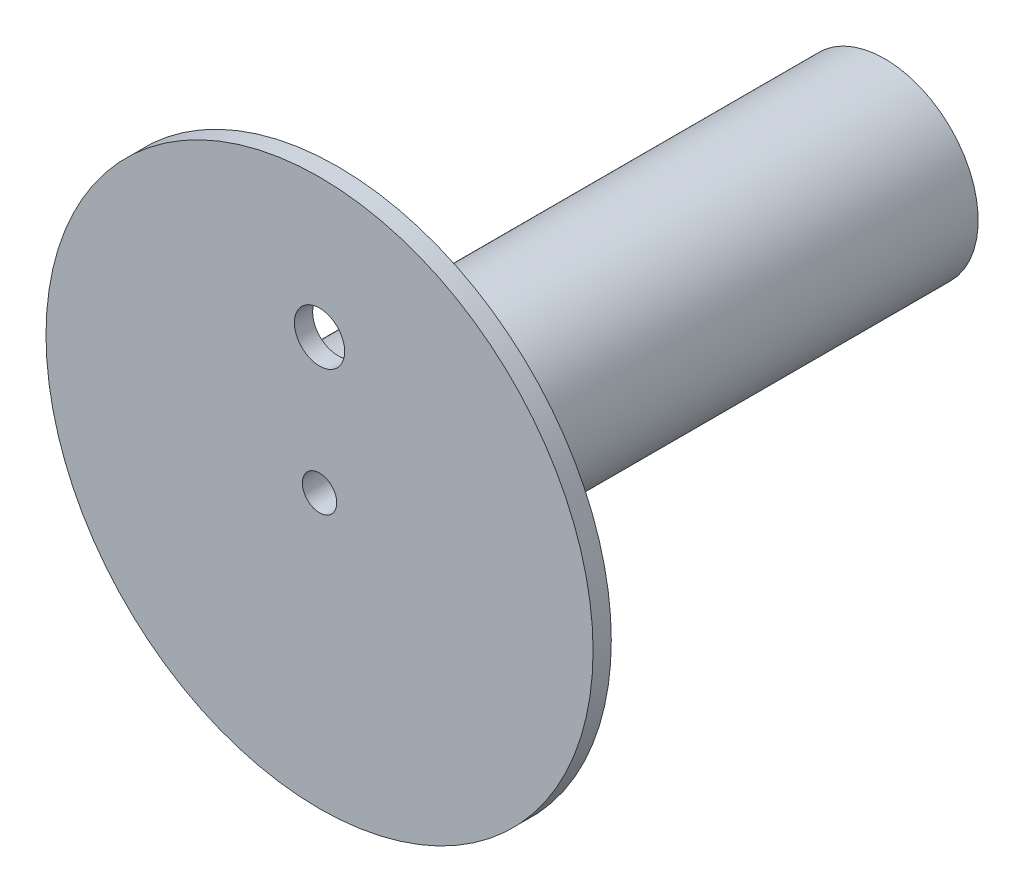
ISO-10303-21;
HEADER;
FILE_DESCRIPTION(('STEP AP214'),'2;1');
FILE_NAME('part.step','',(''),(''),'','','');
FILE_SCHEMA(('AUTOMOTIVE_DESIGN { 1 0 10303 214 1 1 1 1 }'));
ENDSEC;
DATA;
#1=APPLICATION_CONTEXT('core data for automotive mechanical design processes');
#2=APPLICATION_PROTOCOL_DEFINITION('international standard','automotive_design',2000,#1);
#3=PRODUCT_CONTEXT('',#1,'mechanical');
#4=PRODUCT('Part','Part','',(#3));
#5=PRODUCT_RELATED_PRODUCT_CATEGORY('part','',(#4));
#6=PRODUCT_DEFINITION_FORMATION('','',#4);
#7=PRODUCT_DEFINITION_CONTEXT('part definition',#1,'design');
#8=PRODUCT_DEFINITION('design','',#6,#7);
#9=PRODUCT_DEFINITION_SHAPE('','',#8);
#10=(LENGTH_UNIT() NAMED_UNIT(*) SI_UNIT(.MILLI.,.METRE.));
#11=(NAMED_UNIT(*) PLANE_ANGLE_UNIT() SI_UNIT($,.RADIAN.));
#12=(NAMED_UNIT(*) SI_UNIT($,.STERADIAN.) SOLID_ANGLE_UNIT());
#13=UNCERTAINTY_MEASURE_WITH_UNIT(LENGTH_MEASURE(1.E-05),#10,'distance_accuracy_value','');
#14=(GEOMETRIC_REPRESENTATION_CONTEXT(3) GLOBAL_UNCERTAINTY_ASSIGNED_CONTEXT((#13)) GLOBAL_UNIT_ASSIGNED_CONTEXT((#10,
#11,#12)) REPRESENTATION_CONTEXT('',''));
#15=CARTESIAN_POINT('',(0.,0.,0.));
#16=DIRECTION('',(0.,0.,1.));
#17=DIRECTION('',(1.,0.,0.));
#18=AXIS2_PLACEMENT_3D('',#15,#16,#17);
#19=CARTESIAN_POINT('',(0.,0.,38.1));
#20=DIRECTION('',(0.,0.,-1.));
#21=DIRECTION('',(-1.,0.,0.));
#22=AXIS2_PLACEMENT_3D('',#19,#20,#21);
#23=CYLINDRICAL_SURFACE('',#22,6.5);
#24=CARTESIAN_POINT('',(0.,0.,38.1));
#25=DIRECTION('',(0.,0.,1.));
#26=DIRECTION('',(1.,0.,0.));
#27=AXIS2_PLACEMENT_3D('',#24,#25,#26);
#28=CIRCLE('',#27,6.5);
#29=CARTESIAN_POINT('',(-6.5,0.,38.1));
#30=VERTEX_POINT('',#29);
#31=EDGE_CURVE('E10',#30,#30,#28,.T.);
#32=CARTESIAN_POINT('',(0.,0.,0.));
#33=DIRECTION('',(0.,0.,1.));
#34=DIRECTION('',(1.,0.,0.));
#35=AXIS2_PLACEMENT_3D('',#32,#33,#34);
#36=CIRCLE('',#35,6.5);
#37=CARTESIAN_POINT('',(-6.5,0.,0.));
#38=VERTEX_POINT('',#37);
#39=EDGE_CURVE('E40',#38,#38,#36,.T.);
#40=CARTESIAN_POINT('',(-6.5,0.,38.1));
#41=CARTESIAN_POINT('',(-6.5,0.,37.703125));
#42=CARTESIAN_POINT('',(-6.5,0.,37.30625));
#43=CARTESIAN_POINT('',(-6.5,0.,36.5125));
#44=CARTESIAN_POINT('',(-6.5,0.,36.115625));
#45=CARTESIAN_POINT('',(-6.5,0.,35.321875));
#46=CARTESIAN_POINT('',(-6.5,0.,34.925));
#47=CARTESIAN_POINT('',(-6.5,0.,34.13125));
#48=CARTESIAN_POINT('',(-6.5,0.,33.734375));
#49=CARTESIAN_POINT('',(-6.5,0.,32.940625));
#50=CARTESIAN_POINT('',(-6.5,0.,32.54375));
#51=CARTESIAN_POINT('',(-6.5,0.,31.75));
#52=CARTESIAN_POINT('',(-6.5,0.,31.353125));
#53=CARTESIAN_POINT('',(-6.5,0.,30.559375));
#54=CARTESIAN_POINT('',(-6.5,0.,30.1625));
#55=CARTESIAN_POINT('',(-6.5,0.,29.36875));
#56=CARTESIAN_POINT('',(-6.5,0.,28.971875));
#57=CARTESIAN_POINT('',(-6.5,0.,28.178125));
#58=CARTESIAN_POINT('',(-6.5,0.,27.78125));
#59=CARTESIAN_POINT('',(-6.5,0.,26.9875));
#60=CARTESIAN_POINT('',(-6.5,0.,26.590625));
#61=CARTESIAN_POINT('',(-6.5,0.,25.796875));
#62=CARTESIAN_POINT('',(-6.5,0.,25.4));
#63=CARTESIAN_POINT('',(-6.5,0.,24.60625));
#64=CARTESIAN_POINT('',(-6.5,0.,24.209375));
#65=CARTESIAN_POINT('',(-6.5,0.,23.415625));
#66=CARTESIAN_POINT('',(-6.5,0.,23.01875));
#67=CARTESIAN_POINT('',(-6.5,0.,22.225));
#68=CARTESIAN_POINT('',(-6.5,0.,21.828125));
#69=CARTESIAN_POINT('',(-6.5,0.,21.034375));
#70=CARTESIAN_POINT('',(-6.5,0.,20.6375));
#71=CARTESIAN_POINT('',(-6.5,0.,19.84375));
#72=CARTESIAN_POINT('',(-6.5,0.,19.446875));
#73=CARTESIAN_POINT('',(-6.5,0.,18.653125));
#74=CARTESIAN_POINT('',(-6.5,0.,18.25625));
#75=CARTESIAN_POINT('',(-6.5,0.,17.4625));
#76=CARTESIAN_POINT('',(-6.5,0.,17.065625));
#77=CARTESIAN_POINT('',(-6.5,0.,16.271875));
#78=CARTESIAN_POINT('',(-6.5,0.,15.875));
#79=CARTESIAN_POINT('',(-6.5,0.,15.08125));
#80=CARTESIAN_POINT('',(-6.5,0.,14.684375));
#81=CARTESIAN_POINT('',(-6.5,0.,13.890625));
#82=CARTESIAN_POINT('',(-6.5,0.,13.49375));
#83=CARTESIAN_POINT('',(-6.5,0.,12.7));
#84=CARTESIAN_POINT('',(-6.5,0.,12.303125));
#85=CARTESIAN_POINT('',(-6.5,0.,11.509375));
#86=CARTESIAN_POINT('',(-6.5,0.,11.1125));
#87=CARTESIAN_POINT('',(-6.5,0.,10.31875));
#88=CARTESIAN_POINT('',(-6.5,0.,9.921875));
#89=CARTESIAN_POINT('',(-6.5,0.,9.128125));
#90=CARTESIAN_POINT('',(-6.5,0.,8.73125));
#91=CARTESIAN_POINT('',(-6.5,0.,7.9375));
#92=CARTESIAN_POINT('',(-6.5,0.,7.540625));
#93=CARTESIAN_POINT('',(-6.5,0.,6.746875));
#94=CARTESIAN_POINT('',(-6.5,0.,6.35));
#95=CARTESIAN_POINT('',(-6.5,0.,5.55625));
#96=CARTESIAN_POINT('',(-6.5,0.,5.159375));
#97=CARTESIAN_POINT('',(-6.5,0.,4.365625));
#98=CARTESIAN_POINT('',(-6.5,0.,3.96875));
#99=CARTESIAN_POINT('',(-6.5,0.,3.175));
#100=CARTESIAN_POINT('',(-6.5,0.,2.778125));
#101=CARTESIAN_POINT('',(-6.5,0.,1.984375));
#102=CARTESIAN_POINT('',(-6.5,0.,1.5875));
#103=CARTESIAN_POINT('',(-6.5,0.,0.79375));
#104=CARTESIAN_POINT('',(-6.5,0.,0.396875));
#105=CARTESIAN_POINT('',(-6.5,0.,0.));
#106=B_SPLINE_CURVE_WITH_KNOTS('',3,(#40,#41,#42,#43,#44,#45,#46,#47,#48,#49,#50,#51,#52,#53,
#54,#55,#56,#57,#58,#59,#60,#61,#62,#63,#64,#65,#66,#67,#68,#69,#70,#71,#72,#73,#74,#75,#76,#77,
#78,#79,#80,#81,#82,#83,#84,#85,#86,#87,#88,#89,#90,#91,#92,#93,#94,#95,#96,#97,#98,#99,#100,
#101,#102,#103,#104,#105),.UNSPECIFIED.,.F.,.F.,(4,2,2,2,2,2,2,2,2,2,2,2,2,2,2,2,2,2,2,2,2,2,2,
2,2,2,2,2,2,2,2,2,4),(0.,1.19062499999999,2.38124999999999,3.571875,4.7625,5.953125,7.14375,
8.33437499999999,9.525,10.715625,11.90625,13.096875,14.2875,15.478125,16.66875,17.859375,19.05,
20.240625,21.43125,22.621875,23.8125,25.003125,26.19375,27.384375,28.575,29.765625,30.95625,
32.146875,33.3375,34.528125,35.71875,36.909375,38.1),.UNSPECIFIED.);
#107=EDGE_CURVE('BSEAM37',#30,#38,#106,.T.);
#108=ORIENTED_EDGE('',*,*,#31,.F.);
#109=ORIENTED_EDGE('',*,*,#39,.T.);
#110=ORIENTED_EDGE('',*,*,#107,.T.);
#111=ORIENTED_EDGE('',*,*,#107,.F.);
#112=EDGE_LOOP('',(#108,#110,#109,#111));
#113=FACE_BOUND('',#112,.T.);
#114=ADVANCED_FACE('F37',(#113),#23,.T.);
#115=CARTESIAN_POINT('',(0.,0.,0.));
#116=DIRECTION('',(0.,0.,1.));
#117=DIRECTION('',(1.,0.,0.));
#118=AXIS2_PLACEMENT_3D('',#115,#116,#117);
#119=PLANE('',#118);
#120=CARTESIAN_POINT('',(0.,0.,0.));
#121=DIRECTION('',(0.,0.,-1.));
#122=DIRECTION('',(-1.,0.,0.));
#123=AXIS2_PLACEMENT_3D('',#120,#121,#122);
#124=CIRCLE('',#123,1.2);
#125=CARTESIAN_POINT('',(-1.2,0.,0.));
#126=VERTEX_POINT('',#125);
#127=EDGE_CURVE('E55',#126,#126,#124,.T.);
#128=ORIENTED_EDGE('',*,*,#127,.F.);
#129=EDGE_LOOP('',(#128));
#130=FACE_BOUND('',#129,.T.);
#131=ORIENTED_EDGE('',*,*,#39,.F.);
#132=EDGE_LOOP('',(#131));
#133=FACE_BOUND('',#132,.T.);
#134=ADVANCED_FACE('F79',(#130,#133),#119,.F.);
#135=CARTESIAN_POINT('',(0.,0.,39.37));
#136=DIRECTION('',(0.,0.,-1.));
#137=DIRECTION('',(-1.,0.,0.));
#138=AXIS2_PLACEMENT_3D('',#135,#136,#137);
#139=CYLINDRICAL_SURFACE('',#138,19.05);
#140=CARTESIAN_POINT('',(0.,0.,39.37));
#141=DIRECTION('',(0.,0.,1.));
#142=DIRECTION('',(1.,0.,0.));
#143=AXIS2_PLACEMENT_3D('',#140,#141,#142);
#144=CIRCLE('',#143,19.05);
#145=CARTESIAN_POINT('',(19.05,0.,39.37));
#146=VERTEX_POINT('',#145);
#147=EDGE_CURVE('E47',#146,#146,#144,.T.);
#148=ORIENTED_EDGE('',*,*,#147,.F.);
#149=EDGE_LOOP('',(#148));
#150=FACE_BOUND('',#149,.T.);
#151=CARTESIAN_POINT('',(0.,0.,38.1));
#152=DIRECTION('',(0.,0.,1.));
#153=DIRECTION('',(1.,0.,0.));
#154=AXIS2_PLACEMENT_3D('',#151,#152,#153);
#155=CIRCLE('',#154,19.05);
#156=CARTESIAN_POINT('',(19.05,0.,38.1));
#157=VERTEX_POINT('',#156);
#158=EDGE_CURVE('E49',#157,#157,#155,.T.);
#159=ORIENTED_EDGE('',*,*,#158,.T.);
#160=EDGE_LOOP('',(#159));
#161=FACE_BOUND('',#160,.T.);
#162=ADVANCED_FACE('F77',(#150,#161),#139,.T.);
#163=CARTESIAN_POINT('',(0.,0.,39.37));
#164=DIRECTION('',(0.,0.,1.));
#165=DIRECTION('',(1.,0.,0.));
#166=AXIS2_PLACEMENT_3D('',#163,#164,#165);
#167=PLANE('',#166);
#168=CARTESIAN_POINT('',(0.,9.398,39.37));
#169=DIRECTION('',(0.,0.,1.));
#170=DIRECTION('',(1.,0.,0.));
#171=AXIS2_PLACEMENT_3D('',#168,#169,#170);
#172=CIRCLE('',#171,1.75);
#173=CARTESIAN_POINT('',(-1.75,9.398,39.37));
#174=VERTEX_POINT('',#173);
#175=EDGE_CURVE('E58',#174,#174,#172,.T.);
#176=ORIENTED_EDGE('',*,*,#175,.F.);
#177=EDGE_LOOP('',(#176));
#178=FACE_BOUND('',#177,.T.);
#179=CARTESIAN_POINT('',(0.,0.,39.37));
#180=DIRECTION('',(0.,0.,-1.));
#181=DIRECTION('',(-1.,0.,0.));
#182=AXIS2_PLACEMENT_3D('',#179,#180,#181);
#183=CIRCLE('',#182,1.2);
#184=CARTESIAN_POINT('',(-1.2,0.,39.37));
#185=VERTEX_POINT('',#184);
#186=EDGE_CURVE('E52',#185,#185,#183,.T.);
#187=ORIENTED_EDGE('',*,*,#186,.T.);
#188=EDGE_LOOP('',(#187));
#189=FACE_BOUND('',#188,.T.);
#190=ORIENTED_EDGE('',*,*,#147,.T.);
#191=EDGE_LOOP('',(#190));
#192=FACE_BOUND('',#191,.T.);
#193=ADVANCED_FACE('F72',(#178,#189,#192),#167,.T.);
#194=CARTESIAN_POINT('',(0.,0.,38.1));
#195=DIRECTION('',(0.,0.,1.));
#196=DIRECTION('',(1.,0.,0.));
#197=AXIS2_PLACEMENT_3D('',#194,#195,#196);
#198=PLANE('',#197);
#199=CARTESIAN_POINT('',(0.,9.398,38.1));
#200=DIRECTION('',(0.,0.,-1.));
#201=DIRECTION('',(-1.,0.,0.));
#202=AXIS2_PLACEMENT_3D('',#199,#200,#201);
#203=CIRCLE('',#202,1.75);
#204=CARTESIAN_POINT('',(-1.75,9.398,38.1));
#205=VERTEX_POINT('',#204);
#206=EDGE_CURVE('E63',#205,#205,#203,.T.);
#207=ORIENTED_EDGE('',*,*,#206,.F.);
#208=EDGE_LOOP('',(#207));
#209=FACE_BOUND('',#208,.T.);
#210=ORIENTED_EDGE('',*,*,#31,.T.);
#211=EDGE_LOOP('',(#210));
#212=FACE_BOUND('',#211,.T.);
#213=ORIENTED_EDGE('',*,*,#158,.F.);
#214=EDGE_LOOP('',(#213));
#215=FACE_BOUND('',#214,.T.);
#216=ADVANCED_FACE('F69',(#209,#212,#215),#198,.F.);
#217=CARTESIAN_POINT('',(0.,0.,39.37));
#218=DIRECTION('',(0.,0.,-1.));
#219=DIRECTION('',(-1.,0.,0.));
#220=AXIS2_PLACEMENT_3D('',#217,#218,#219);
#221=CYLINDRICAL_SURFACE('',#220,1.2);
#222=ORIENTED_EDGE('',*,*,#186,.F.);
#223=EDGE_LOOP('',(#222));
#224=FACE_BOUND('',#223,.T.);
#225=ORIENTED_EDGE('',*,*,#127,.T.);
#226=EDGE_LOOP('',(#225));
#227=FACE_BOUND('',#226,.T.);
#228=ADVANCED_FACE('F71',(#224,#227),#221,.F.);
#229=CARTESIAN_POINT('',(0.,9.398,45.72));
#230=DIRECTION('',(0.,0.,-1.));
#231=DIRECTION('',(-1.,0.,0.));
#232=AXIS2_PLACEMENT_3D('',#229,#230,#231);
#233=CYLINDRICAL_SURFACE('',#232,1.75);
#234=CARTESIAN_POINT('',(-1.75,9.398,39.37));
#235=CARTESIAN_POINT('',(-1.75,9.398,39.3567708333333));
#236=CARTESIAN_POINT('',(-1.75,9.398,39.3435416666667));
#237=CARTESIAN_POINT('',(-1.75,9.398,39.3170833333333));
#238=CARTESIAN_POINT('',(-1.75,9.398,39.3038541666667));
#239=CARTESIAN_POINT('',(-1.75,9.398,39.2773958333333));
#240=CARTESIAN_POINT('',(-1.75,9.398,39.2641666666667));
#241=CARTESIAN_POINT('',(-1.75,9.398,39.2377083333333));
#242=CARTESIAN_POINT('',(-1.75,9.398,39.2244791666667));
#243=CARTESIAN_POINT('',(-1.75,9.398,39.1980208333333));
#244=CARTESIAN_POINT('',(-1.75,9.398,39.1847916666667));
#245=CARTESIAN_POINT('',(-1.75,9.398,39.1583333333333));
#246=CARTESIAN_POINT('',(-1.75,9.398,39.1451041666667));
#247=CARTESIAN_POINT('',(-1.75,9.398,39.1186458333333));
#248=CARTESIAN_POINT('',(-1.75,9.398,39.1054166666667));
#249=CARTESIAN_POINT('',(-1.75,9.398,39.0789583333333));
#250=CARTESIAN_POINT('',(-1.75,9.398,39.0657291666667));
#251=CARTESIAN_POINT('',(-1.75,9.398,39.0392708333333));
#252=CARTESIAN_POINT('',(-1.75,9.398,39.0260416666667));
#253=CARTESIAN_POINT('',(-1.75,9.398,38.9995833333333));
#254=CARTESIAN_POINT('',(-1.75,9.398,38.9863541666667));
#255=CARTESIAN_POINT('',(-1.75,9.398,38.9598958333333));
#256=CARTESIAN_POINT('',(-1.75,9.398,38.9466666666667));
#257=CARTESIAN_POINT('',(-1.75,9.398,38.9202083333333));
#258=CARTESIAN_POINT('',(-1.75,9.398,38.9069791666667));
#259=CARTESIAN_POINT('',(-1.75,9.398,38.8805208333333));
#260=CARTESIAN_POINT('',(-1.75,9.398,38.8672916666667));
#261=CARTESIAN_POINT('',(-1.75,9.398,38.8408333333333));
#262=CARTESIAN_POINT('',(-1.75,9.398,38.8276041666667));
#263=CARTESIAN_POINT('',(-1.75,9.398,38.8011458333333));
#264=CARTESIAN_POINT('',(-1.75,9.398,38.7879166666667));
#265=CARTESIAN_POINT('',(-1.75,9.398,38.7614583333333));
#266=CARTESIAN_POINT('',(-1.75,9.398,38.7482291666667));
#267=CARTESIAN_POINT('',(-1.75,9.398,38.7217708333333));
#268=CARTESIAN_POINT('',(-1.75,9.398,38.7085416666667));
#269=CARTESIAN_POINT('',(-1.75,9.398,38.6820833333333));
#270=CARTESIAN_POINT('',(-1.75,9.398,38.6688541666667));
#271=CARTESIAN_POINT('',(-1.75,9.398,38.6423958333333));
#272=CARTESIAN_POINT('',(-1.75,9.398,38.6291666666667));
#273=CARTESIAN_POINT('',(-1.75,9.398,38.6027083333333));
#274=CARTESIAN_POINT('',(-1.75,9.398,38.5894791666667));
#275=CARTESIAN_POINT('',(-1.75,9.398,38.5630208333333));
#276=CARTESIAN_POINT('',(-1.75,9.398,38.5497916666667));
#277=CARTESIAN_POINT('',(-1.75,9.398,38.5233333333333));
#278=CARTESIAN_POINT('',(-1.75,9.398,38.5101041666667));
#279=CARTESIAN_POINT('',(-1.75,9.398,38.4836458333333));
#280=CARTESIAN_POINT('',(-1.75,9.398,38.4704166666667));
#281=CARTESIAN_POINT('',(-1.75,9.398,38.4439583333333));
#282=CARTESIAN_POINT('',(-1.75,9.398,38.4307291666667));
#283=CARTESIAN_POINT('',(-1.75,9.398,38.4042708333333));
#284=CARTESIAN_POINT('',(-1.75,9.398,38.3910416666667));
#285=CARTESIAN_POINT('',(-1.75,9.398,38.3645833333333));
#286=CARTESIAN_POINT('',(-1.75,9.398,38.3513541666667));
#287=CARTESIAN_POINT('',(-1.75,9.398,38.3248958333333));
#288=CARTESIAN_POINT('',(-1.75,9.398,38.3116666666667));
#289=CARTESIAN_POINT('',(-1.75,9.398,38.2852083333333));
#290=CARTESIAN_POINT('',(-1.75,9.398,38.2719791666667));
#291=CARTESIAN_POINT('',(-1.75,9.398,38.2455208333333));
#292=CARTESIAN_POINT('',(-1.75,9.398,38.2322916666667));
#293=CARTESIAN_POINT('',(-1.75,9.398,38.2058333333333));
#294=CARTESIAN_POINT('',(-1.75,9.398,38.1926041666667));
#295=CARTESIAN_POINT('',(-1.75,9.398,38.1661458333333));
#296=CARTESIAN_POINT('',(-1.75,9.398,38.1529166666667));
#297=CARTESIAN_POINT('',(-1.75,9.398,38.1264583333333));
#298=CARTESIAN_POINT('',(-1.75,9.398,38.1132291666667));
#299=CARTESIAN_POINT('',(-1.75,9.398,38.1));
#300=B_SPLINE_CURVE_WITH_KNOTS('',3,(#234,#235,#236,#237,#238,#239,#240,#241,#242,#243,#244,
#245,#246,#247,#248,#249,#250,#251,#252,#253,#254,#255,#256,#257,#258,#259,#260,#261,#262,#263,
#264,#265,#266,#267,#268,#269,#270,#271,#272,#273,#274,#275,#276,#277,#278,#279,#280,#281,#282,
#283,#284,#285,#286,#287,#288,#289,#290,#291,#292,#293,#294,#295,#296,#297,#298,#299),
.UNSPECIFIED.,.F.,.F.,(4,2,2,2,2,2,2,2,2,2,2,2,2,2,2,2,2,2,2,2,2,2,2,2,2,2,2,2,2,2,2,2,4),(0.,
0.0396874999999963,0.0793749999999996,0.119062499999996,0.158749999999999,0.198437499999995,
0.238124999999999,0.277812499999995,0.317499999999998,0.357187499999995,0.396874999999998,
0.436562499999994,0.476249999999998,0.515937499999994,0.555624999999997,0.595312499999993,
0.634999999999997,0.674687499999993,0.714374999999996,0.754062499999993,0.793749999999996,
0.833437499999992,0.873124999999995,0.912812499999992,0.952499999999995,0.992187499999991,
1.03187499999999,1.07156249999999,1.11124999999999,1.15093749999999,1.19062499999999,
1.23031249999999,1.26999999999999),.UNSPECIFIED.);
#301=EDGE_CURVE('BSEAM67',#174,#205,#300,.T.);
#302=ORIENTED_EDGE('',*,*,#175,.T.);
#303=ORIENTED_EDGE('',*,*,#206,.T.);
#304=ORIENTED_EDGE('',*,*,#301,.T.);
#305=ORIENTED_EDGE('',*,*,#301,.F.);
#306=EDGE_LOOP('',(#302,#304,#303,#305));
#307=FACE_BOUND('',#306,.T.);
#308=ADVANCED_FACE('F67',(#307),#233,.F.);
#309=CLOSED_SHELL('',(#114,#134,#162,#193,#216,#228,#308));
#310=MANIFOLD_SOLID_BREP('B2',#309);
#311=ADVANCED_BREP_SHAPE_REPRESENTATION('',(#18,#310),#14);
#312=SHAPE_DEFINITION_REPRESENTATION(#9,#311);
ENDSEC;
END-ISO-10303-21;
